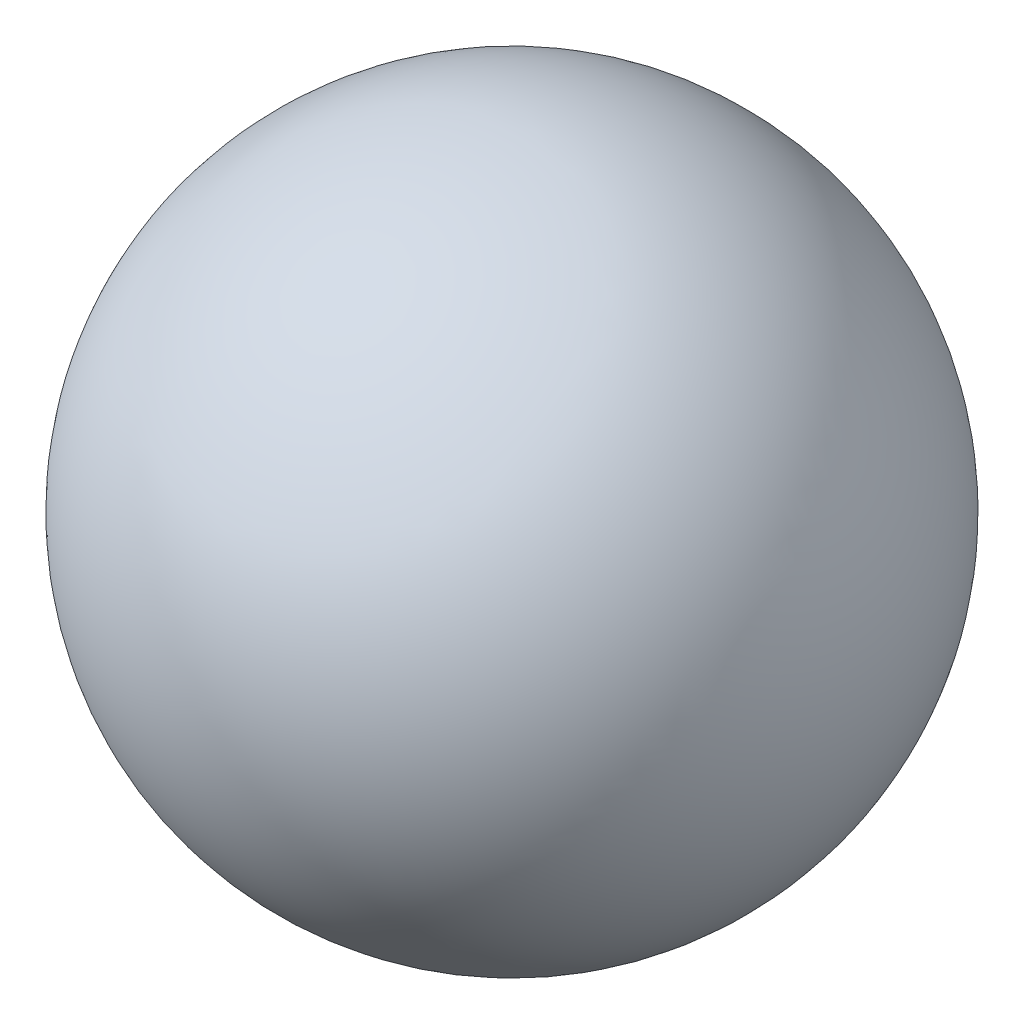
ISO-10303-21;
HEADER;
FILE_DESCRIPTION(('STEP AP214'),'2;1');
FILE_NAME('part.step','',(''),(''),'','','');
FILE_SCHEMA(('AUTOMOTIVE_DESIGN { 1 0 10303 214 1 1 1 1 }'));
ENDSEC;
DATA;
#1=APPLICATION_CONTEXT('core data for automotive mechanical design processes');
#2=APPLICATION_PROTOCOL_DEFINITION('international standard','automotive_design',2000,#1);
#3=PRODUCT_CONTEXT('',#1,'mechanical');
#4=PRODUCT('Part','Part','',(#3));
#5=PRODUCT_RELATED_PRODUCT_CATEGORY('part','',(#4));
#6=PRODUCT_DEFINITION_FORMATION('','',#4);
#7=PRODUCT_DEFINITION_CONTEXT('part definition',#1,'design');
#8=PRODUCT_DEFINITION('design','',#6,#7);
#9=PRODUCT_DEFINITION_SHAPE('','',#8);
#10=(LENGTH_UNIT() NAMED_UNIT(*) SI_UNIT(.MILLI.,.METRE.));
#11=(NAMED_UNIT(*) PLANE_ANGLE_UNIT() SI_UNIT($,.RADIAN.));
#12=(NAMED_UNIT(*) SI_UNIT($,.STERADIAN.) SOLID_ANGLE_UNIT());
#13=UNCERTAINTY_MEASURE_WITH_UNIT(LENGTH_MEASURE(1.E-05),#10,'distance_accuracy_value','');
#14=(GEOMETRIC_REPRESENTATION_CONTEXT(3) GLOBAL_UNCERTAINTY_ASSIGNED_CONTEXT((#13)) GLOBAL_UNIT_ASSIGNED_CONTEXT((#10,
#11,#12)) REPRESENTATION_CONTEXT('',''));
#15=CARTESIAN_POINT('',(0.,0.,0.));
#16=DIRECTION('',(0.,0.,1.));
#17=DIRECTION('',(1.,0.,0.));
#18=AXIS2_PLACEMENT_3D('',#15,#16,#17);
#19=CARTESIAN_POINT('',(0.,0.,0.));
#20=DIRECTION('',(-1.,0.,0.));
#21=DIRECTION('',(0.,1.,0.));
#22=AXIS2_PLACEMENT_3D('',#19,#20,#21);
#23=SPHERICAL_SURFACE('',#22,20.32);
#24=CARTESIAN_POINT('',(-20.32,0.,0.));
#25=VERTEX_POINT('',#24);
#26=VERTEX_LOOP('',#25);
#27=FACE_BOUND('',#26,.T.);
#28=ADVANCED_FACE('F33',(#27),#23,.T.);
#29=CLOSED_SHELL('',(#28));
#30=MANIFOLD_SOLID_BREP('B2',#29);
#31=ADVANCED_BREP_SHAPE_REPRESENTATION('',(#18,#30),#14);
#32=SHAPE_DEFINITION_REPRESENTATION(#9,#31);
ENDSEC;
END-ISO-10303-21;
